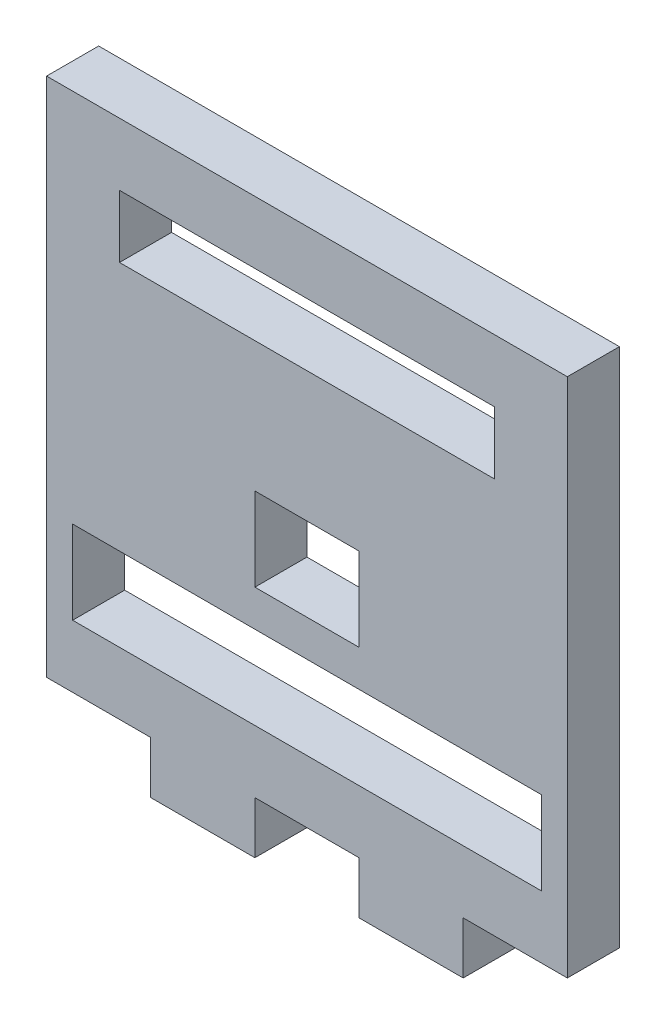
ISO-10303-21;
HEADER;
FILE_DESCRIPTION(('STEP AP214'),'2;1');
FILE_NAME('part.step','',(''),(''),'','','');
FILE_SCHEMA(('AUTOMOTIVE_DESIGN { 1 0 10303 214 1 1 1 1 }'));
ENDSEC;
DATA;
#1=APPLICATION_CONTEXT('core data for automotive mechanical design processes');
#2=APPLICATION_PROTOCOL_DEFINITION('international standard','automotive_design',2000,#1);
#3=PRODUCT_CONTEXT('',#1,'mechanical');
#4=PRODUCT('Part','Part','',(#3));
#5=PRODUCT_RELATED_PRODUCT_CATEGORY('part','',(#4));
#6=PRODUCT_DEFINITION_FORMATION('','',#4);
#7=PRODUCT_DEFINITION_CONTEXT('part definition',#1,'design');
#8=PRODUCT_DEFINITION('design','',#6,#7);
#9=PRODUCT_DEFINITION_SHAPE('','',#8);
#10=(LENGTH_UNIT() NAMED_UNIT(*) SI_UNIT(.MILLI.,.METRE.));
#11=(NAMED_UNIT(*) PLANE_ANGLE_UNIT() SI_UNIT($,.RADIAN.));
#12=(NAMED_UNIT(*) SI_UNIT($,.STERADIAN.) SOLID_ANGLE_UNIT());
#13=UNCERTAINTY_MEASURE_WITH_UNIT(LENGTH_MEASURE(1.E-05),#10,'distance_accuracy_value','');
#14=(GEOMETRIC_REPRESENTATION_CONTEXT(3) GLOBAL_UNCERTAINTY_ASSIGNED_CONTEXT((#13)) GLOBAL_UNIT_ASSIGNED_CONTEXT((#10,
#11,#12)) REPRESENTATION_CONTEXT('',''));
#15=CARTESIAN_POINT('',(0.,0.,0.));
#16=DIRECTION('',(0.,0.,1.));
#17=DIRECTION('',(1.,0.,0.));
#18=AXIS2_PLACEMENT_3D('',#15,#16,#17);
#19=CARTESIAN_POINT('',(0.,0.,5.));
#20=DIRECTION('',(0.,1.,0.));
#21=DIRECTION('',(0.,0.,1.));
#22=AXIS2_PLACEMENT_3D('',#19,#20,#21);
#23=PLANE('',#22);
#24=DIRECTION('',(1.,0.,0.));
#25=VECTOR('',#24,1.);
#26=CARTESIAN_POINT('',(0.,0.,0.));
#27=LINE('',#26,#25);
#28=CARTESIAN_POINT('',(-30.,0.,0.));
#29=VERTEX_POINT('',#28);
#30=CARTESIAN_POINT('',(-20.,0.,0.));
#31=VERTEX_POINT('',#30);
#32=EDGE_CURVE('E375',#29,#31,#27,.T.);
#33=ORIENTED_EDGE('',*,*,#32,.T.);
#34=DIRECTION('',(0.,0.,1.));
#35=VECTOR('',#34,1.);
#36=CARTESIAN_POINT('',(-20.,0.,0.));
#37=LINE('',#36,#35);
#38=CARTESIAN_POINT('',(-20.,0.,5.));
#39=VERTEX_POINT('',#38);
#40=EDGE_CURVE('E56',#31,#39,#37,.T.);
#41=ORIENTED_EDGE('',*,*,#40,.T.);
#42=DIRECTION('',(1.,0.,0.));
#43=VECTOR('',#42,1.);
#44=CARTESIAN_POINT('',(0.,0.,5.));
#45=LINE('',#44,#43);
#46=CARTESIAN_POINT('',(-30.,0.,5.));
#47=VERTEX_POINT('',#46);
#48=EDGE_CURVE('E365',#47,#39,#45,.T.);
#49=ORIENTED_EDGE('',*,*,#48,.F.);
#50=DIRECTION('',(0.,0.,1.));
#51=VECTOR('',#50,1.);
#52=CARTESIAN_POINT('',(-30.,0.,0.));
#53=LINE('',#52,#51);
#54=EDGE_CURVE('E255',#29,#47,#53,.T.);
#55=ORIENTED_EDGE('',*,*,#54,.F.);
#56=EDGE_LOOP('',(#33,#41,#49,#55));
#57=FACE_BOUND('',#56,.T.);
#58=ADVANCED_FACE('F33',(#57),#23,.F.);
#59=CARTESIAN_POINT('',(-10.,0.,5.));
#60=VERTEX_POINT('',#59);
#61=CARTESIAN_POINT('',(0.,0.,5.));
#62=VERTEX_POINT('',#61);
#63=EDGE_CURVE('E48',#60,#62,#45,.T.);
#64=ORIENTED_EDGE('',*,*,#63,.F.);
#65=DIRECTION('',(0.,0.,1.));
#66=VECTOR('',#65,1.);
#67=CARTESIAN_POINT('',(-10.,0.,0.));
#68=LINE('',#67,#66);
#69=CARTESIAN_POINT('',(-10.,0.,0.));
#70=VERTEX_POINT('',#69);
#71=EDGE_CURVE('E231',#70,#60,#68,.T.);
#72=ORIENTED_EDGE('',*,*,#71,.F.);
#73=CARTESIAN_POINT('',(0.,0.,0.));
#74=VERTEX_POINT('',#73);
#75=EDGE_CURVE('E372',#70,#74,#27,.T.);
#76=ORIENTED_EDGE('',*,*,#75,.T.);
#77=DIRECTION('',(0.,0.,-1.));
#78=VECTOR('',#77,1.);
#79=CARTESIAN_POINT('',(0.,0.,5.));
#80=LINE('',#79,#78);
#81=EDGE_CURVE('E364',#62,#74,#80,.T.);
#82=ORIENTED_EDGE('',*,*,#81,.F.);
#83=EDGE_LOOP('',(#64,#72,#76,#82));
#84=FACE_BOUND('',#83,.T.);
#85=ADVANCED_FACE('F401',(#84),#23,.F.);
#86=CARTESIAN_POINT('',(0.,0.,5.));
#87=DIRECTION('',(0.,0.,1.));
#88=DIRECTION('',(1.,0.,0.));
#89=AXIS2_PLACEMENT_3D('',#86,#87,#88);
#90=PLANE('',#89);
#91=DIRECTION('',(0.,1.,0.));
#92=VECTOR('',#91,1.);
#93=CARTESIAN_POINT('',(0.,0.,5.));
#94=LINE('',#93,#92);
#95=CARTESIAN_POINT('',(0.,50.,5.));
#96=VERTEX_POINT('',#95);
#97=EDGE_CURVE('E353',#62,#96,#94,.T.);
#98=ORIENTED_EDGE('',*,*,#97,.T.);
#99=DIRECTION('',(-1.,0.,0.));
#100=VECTOR('',#99,1.);
#101=CARTESIAN_POINT('',(0.,50.,5.));
#102=LINE('',#101,#100);
#103=CARTESIAN_POINT('',(-50.,50.,5.));
#104=VERTEX_POINT('',#103);
#105=EDGE_CURVE('E356',#96,#104,#102,.T.);
#106=ORIENTED_EDGE('',*,*,#105,.T.);
#107=DIRECTION('',(0.,-1.,0.));
#108=VECTOR('',#107,1.);
#109=CARTESIAN_POINT('',(-50.,0.,5.));
#110=LINE('',#109,#108);
#111=CARTESIAN_POINT('',(-50.,0.,5.));
#112=VERTEX_POINT('',#111);
#113=EDGE_CURVE('E359',#104,#112,#110,.T.);
#114=ORIENTED_EDGE('',*,*,#113,.T.);
#115=CARTESIAN_POINT('',(-40.,0.,5.));
#116=VERTEX_POINT('',#115);
#117=EDGE_CURVE('E361',#112,#116,#45,.T.);
#118=ORIENTED_EDGE('',*,*,#117,.T.);
#119=DIRECTION('',(0.,-1.,0.));
#120=VECTOR('',#119,1.);
#121=CARTESIAN_POINT('',(-40.,0.,5.));
#122=LINE('',#121,#120);
#123=CARTESIAN_POINT('',(-40.,-5.,5.));
#124=VERTEX_POINT('',#123);
#125=EDGE_CURVE('E230',#116,#124,#122,.T.);
#126=ORIENTED_EDGE('',*,*,#125,.T.);
#127=DIRECTION('',(1.,0.,0.));
#128=VECTOR('',#127,1.);
#129=CARTESIAN_POINT('',(-40.,-5.,5.));
#130=LINE('',#129,#128);
#131=CARTESIAN_POINT('',(-30.,-5.,5.));
#132=VERTEX_POINT('',#131);
#133=EDGE_CURVE('E246',#124,#132,#130,.T.);
#134=ORIENTED_EDGE('',*,*,#133,.T.);
#135=DIRECTION('',(0.,1.,0.));
#136=VECTOR('',#135,1.);
#137=CARTESIAN_POINT('',(-30.,0.,5.));
#138=LINE('',#137,#136);
#139=EDGE_CURVE('E238',#132,#47,#138,.T.);
#140=ORIENTED_EDGE('',*,*,#139,.T.);
#141=ORIENTED_EDGE('',*,*,#48,.T.);
#142=DIRECTION('',(0.,-1.,0.));
#143=VECTOR('',#142,1.);
#144=CARTESIAN_POINT('',(-20.,0.,5.));
#145=LINE('',#144,#143);
#146=CARTESIAN_POINT('',(-20.,-5.,5.));
#147=VERTEX_POINT('',#146);
#148=EDGE_CURVE('E226',#39,#147,#145,.T.);
#149=ORIENTED_EDGE('',*,*,#148,.T.);
#150=DIRECTION('',(1.,0.,0.));
#151=VECTOR('',#150,1.);
#152=CARTESIAN_POINT('',(-20.,-5.,5.));
#153=LINE('',#152,#151);
#154=CARTESIAN_POINT('',(-10.,-5.,5.));
#155=VERTEX_POINT('',#154);
#156=EDGE_CURVE('E201',#147,#155,#153,.T.);
#157=ORIENTED_EDGE('',*,*,#156,.T.);
#158=DIRECTION('',(0.,1.,0.));
#159=VECTOR('',#158,1.);
#160=CARTESIAN_POINT('',(-10.,0.,5.));
#161=LINE('',#160,#159);
#162=EDGE_CURVE('E220',#155,#60,#161,.T.);
#163=ORIENTED_EDGE('',*,*,#162,.T.);
#164=ORIENTED_EDGE('',*,*,#63,.T.);
#165=EDGE_LOOP('',(#98,#106,#114,#118,#126,#134,#140,#141,#149,#157,#163,#164));
#166=FACE_BOUND('',#165,.T.);
#167=DIRECTION('',(1.,0.,0.));
#168=VECTOR('',#167,1.);
#169=CARTESIAN_POINT('',(-43.,38.,5.));
#170=LINE('',#169,#168);
#171=CARTESIAN_POINT('',(-43.,38.,5.));
#172=VERTEX_POINT('',#171);
#173=CARTESIAN_POINT('',(-7.,38.,5.));
#174=VERTEX_POINT('',#173);
#175=EDGE_CURVE('E324',#172,#174,#170,.T.);
#176=ORIENTED_EDGE('',*,*,#175,.F.);
#177=DIRECTION('',(0.,-1.,0.));
#178=VECTOR('',#177,1.);
#179=CARTESIAN_POINT('',(-43.,44.,5.));
#180=LINE('',#179,#178);
#181=CARTESIAN_POINT('',(-43.,44.,5.));
#182=VERTEX_POINT('',#181);
#183=EDGE_CURVE('E322',#182,#172,#180,.T.);
#184=ORIENTED_EDGE('',*,*,#183,.F.);
#185=DIRECTION('',(-1.,0.,0.));
#186=VECTOR('',#185,1.);
#187=CARTESIAN_POINT('',(-43.,44.,5.));
#188=LINE('',#187,#186);
#189=CARTESIAN_POINT('',(-7.,44.,5.));
#190=VERTEX_POINT('',#189);
#191=EDGE_CURVE('E330',#190,#182,#188,.T.);
#192=ORIENTED_EDGE('',*,*,#191,.F.);
#193=DIRECTION('',(0.,1.,0.));
#194=VECTOR('',#193,1.);
#195=CARTESIAN_POINT('',(-7.,44.,5.));
#196=LINE('',#195,#194);
#197=EDGE_CURVE('E327',#174,#190,#196,.T.);
#198=ORIENTED_EDGE('',*,*,#197,.F.);
#199=EDGE_LOOP('',(#176,#184,#192,#198));
#200=FACE_BOUND('',#199,.T.);
#201=DIRECTION('',(1.,0.,0.));
#202=VECTOR('',#201,1.);
#203=CARTESIAN_POINT('',(-30.,17.5,5.));
#204=LINE('',#203,#202);
#205=CARTESIAN_POINT('',(-30.,17.5,5.));
#206=VERTEX_POINT('',#205);
#207=CARTESIAN_POINT('',(-20.,17.5,5.));
#208=VERTEX_POINT('',#207);
#209=EDGE_CURVE('E293',#206,#208,#204,.T.);
#210=ORIENTED_EDGE('',*,*,#209,.F.);
#211=DIRECTION('',(0.,-1.,0.));
#212=VECTOR('',#211,1.);
#213=CARTESIAN_POINT('',(-30.,25.5,5.));
#214=LINE('',#213,#212);
#215=CARTESIAN_POINT('',(-30.,25.5,5.));
#216=VERTEX_POINT('',#215);
#217=EDGE_CURVE('E291',#216,#206,#214,.T.);
#218=ORIENTED_EDGE('',*,*,#217,.F.);
#219=DIRECTION('',(-1.,0.,0.));
#220=VECTOR('',#219,1.);
#221=CARTESIAN_POINT('',(-30.,25.5,5.));
#222=LINE('',#221,#220);
#223=CARTESIAN_POINT('',(-20.,25.5,5.));
#224=VERTEX_POINT('',#223);
#225=EDGE_CURVE('E299',#224,#216,#222,.T.);
#226=ORIENTED_EDGE('',*,*,#225,.F.);
#227=DIRECTION('',(0.,1.,0.));
#228=VECTOR('',#227,1.);
#229=CARTESIAN_POINT('',(-20.,25.5,5.));
#230=LINE('',#229,#228);
#231=EDGE_CURVE('E296',#208,#224,#230,.T.);
#232=ORIENTED_EDGE('',*,*,#231,.F.);
#233=EDGE_LOOP('',(#210,#218,#226,#232));
#234=FACE_BOUND('',#233,.T.);
#235=DIRECTION('',(1.,0.,0.));
#236=VECTOR('',#235,1.);
#237=CARTESIAN_POINT('',(-47.5,6.,5.));
#238=LINE('',#237,#236);
#239=CARTESIAN_POINT('',(-47.5,6.,5.));
#240=VERTEX_POINT('',#239);
#241=CARTESIAN_POINT('',(-2.5,6.,5.));
#242=VERTEX_POINT('',#241);
#243=EDGE_CURVE('E262',#240,#242,#238,.T.);
#244=ORIENTED_EDGE('',*,*,#243,.F.);
#245=DIRECTION('',(0.,-1.,0.));
#246=VECTOR('',#245,1.);
#247=CARTESIAN_POINT('',(-47.5,14.,5.));
#248=LINE('',#247,#246);
#249=CARTESIAN_POINT('',(-47.5,14.,5.));
#250=VERTEX_POINT('',#249);
#251=EDGE_CURVE('E260',#250,#240,#248,.T.);
#252=ORIENTED_EDGE('',*,*,#251,.F.);
#253=DIRECTION('',(-1.,0.,0.));
#254=VECTOR('',#253,1.);
#255=CARTESIAN_POINT('',(-47.5,14.,5.));
#256=LINE('',#255,#254);
#257=CARTESIAN_POINT('',(-2.5,14.,5.));
#258=VERTEX_POINT('',#257);
#259=EDGE_CURVE('E268',#258,#250,#256,.T.);
#260=ORIENTED_EDGE('',*,*,#259,.F.);
#261=DIRECTION('',(0.,1.,0.));
#262=VECTOR('',#261,1.);
#263=CARTESIAN_POINT('',(-2.5,14.,5.));
#264=LINE('',#263,#262);
#265=EDGE_CURVE('E265',#242,#258,#264,.T.);
#266=ORIENTED_EDGE('',*,*,#265,.F.);
#267=EDGE_LOOP('',(#244,#252,#260,#266));
#268=FACE_BOUND('',#267,.T.);
#269=ADVANCED_FACE('F395',(#166,#200,#234,#268),#90,.T.);
#270=CARTESIAN_POINT('',(0.,0.,0.));
#271=DIRECTION('',(0.,0.,1.));
#272=DIRECTION('',(1.,0.,0.));
#273=AXIS2_PLACEMENT_3D('',#270,#271,#272);
#274=PLANE('',#273);
#275=DIRECTION('',(0.,-1.,0.));
#276=VECTOR('',#275,1.);
#277=CARTESIAN_POINT('',(-30.,25.5,0.));
#278=LINE('',#277,#276);
#279=CARTESIAN_POINT('',(-30.,25.5,0.));
#280=VERTEX_POINT('',#279);
#281=CARTESIAN_POINT('',(-30.,17.5,0.));
#282=VERTEX_POINT('',#281);
#283=EDGE_CURVE('E290',#280,#282,#278,.T.);
#284=ORIENTED_EDGE('',*,*,#283,.T.);
#285=DIRECTION('',(1.,0.,0.));
#286=VECTOR('',#285,1.);
#287=CARTESIAN_POINT('',(-30.,17.5,0.));
#288=LINE('',#287,#286);
#289=CARTESIAN_POINT('',(-20.,17.5,0.));
#290=VERTEX_POINT('',#289);
#291=EDGE_CURVE('E304',#282,#290,#288,.T.);
#292=ORIENTED_EDGE('',*,*,#291,.T.);
#293=DIRECTION('',(0.,1.,0.));
#294=VECTOR('',#293,1.);
#295=CARTESIAN_POINT('',(-20.,25.5,0.));
#296=LINE('',#295,#294);
#297=CARTESIAN_POINT('',(-20.,25.5,0.));
#298=VERTEX_POINT('',#297);
#299=EDGE_CURVE('E307',#290,#298,#296,.T.);
#300=ORIENTED_EDGE('',*,*,#299,.T.);
#301=DIRECTION('',(-1.,0.,0.));
#302=VECTOR('',#301,1.);
#303=CARTESIAN_POINT('',(-30.,25.5,0.));
#304=LINE('',#303,#302);
#305=EDGE_CURVE('E294',#298,#280,#304,.T.);
#306=ORIENTED_EDGE('',*,*,#305,.T.);
#307=EDGE_LOOP('',(#284,#292,#300,#306));
#308=FACE_BOUND('',#307,.T.);
#309=DIRECTION('',(0.,1.,0.));
#310=VECTOR('',#309,1.);
#311=CARTESIAN_POINT('',(0.,0.,0.));
#312=LINE('',#311,#310);
#313=CARTESIAN_POINT('',(0.,50.,0.));
#314=VERTEX_POINT('',#313);
#315=EDGE_CURVE('E352',#74,#314,#312,.T.);
#316=ORIENTED_EDGE('',*,*,#315,.F.);
#317=ORIENTED_EDGE('',*,*,#75,.F.);
#318=DIRECTION('',(0.,1.,0.));
#319=VECTOR('',#318,1.);
#320=CARTESIAN_POINT('',(-10.,0.,0.));
#321=LINE('',#320,#319);
#322=CARTESIAN_POINT('',(-10.,-5.,0.));
#323=VERTEX_POINT('',#322);
#324=EDGE_CURVE('E207',#323,#70,#321,.T.);
#325=ORIENTED_EDGE('',*,*,#324,.F.);
#326=DIRECTION('',(1.,0.,0.));
#327=VECTOR('',#326,1.);
#328=CARTESIAN_POINT('',(-20.,-5.,0.));
#329=LINE('',#328,#327);
#330=CARTESIAN_POINT('',(-20.,-5.,0.));
#331=VERTEX_POINT('',#330);
#332=EDGE_CURVE('E199',#331,#323,#329,.T.);
#333=ORIENTED_EDGE('',*,*,#332,.F.);
#334=DIRECTION('',(0.,-1.,0.));
#335=VECTOR('',#334,1.);
#336=CARTESIAN_POINT('',(-20.,0.,0.));
#337=LINE('',#336,#335);
#338=EDGE_CURVE('E216',#31,#331,#337,.T.);
#339=ORIENTED_EDGE('',*,*,#338,.F.);
#340=ORIENTED_EDGE('',*,*,#32,.F.);
#341=DIRECTION('',(0.,1.,0.));
#342=VECTOR('',#341,1.);
#343=CARTESIAN_POINT('',(-30.,0.,0.));
#344=LINE('',#343,#342);
#345=CARTESIAN_POINT('',(-30.,-5.,0.));
#346=VERTEX_POINT('',#345);
#347=EDGE_CURVE('E241',#346,#29,#344,.T.);
#348=ORIENTED_EDGE('',*,*,#347,.F.);
#349=DIRECTION('',(1.,0.,0.));
#350=VECTOR('',#349,1.);
#351=CARTESIAN_POINT('',(-40.,-5.,0.));
#352=LINE('',#351,#350);
#353=CARTESIAN_POINT('',(-40.,-5.,0.));
#354=VERTEX_POINT('',#353);
#355=EDGE_CURVE('E237',#354,#346,#352,.T.);
#356=ORIENTED_EDGE('',*,*,#355,.F.);
#357=DIRECTION('',(0.,-1.,0.));
#358=VECTOR('',#357,1.);
#359=CARTESIAN_POINT('',(-40.,0.,0.));
#360=LINE('',#359,#358);
#361=CARTESIAN_POINT('',(-40.,0.,0.));
#362=VERTEX_POINT('',#361);
#363=EDGE_CURVE('E234',#362,#354,#360,.T.);
#364=ORIENTED_EDGE('',*,*,#363,.F.);
#365=CARTESIAN_POINT('',(-50.,0.,0.));
#366=VERTEX_POINT('',#365);
#367=EDGE_CURVE('E357',#366,#362,#27,.T.);
#368=ORIENTED_EDGE('',*,*,#367,.F.);
#369=DIRECTION('',(0.,-1.,0.));
#370=VECTOR('',#369,1.);
#371=CARTESIAN_POINT('',(-50.,0.,0.));
#372=LINE('',#371,#370);
#373=CARTESIAN_POINT('',(-50.,50.,0.));
#374=VERTEX_POINT('',#373);
#375=EDGE_CURVE('E370',#374,#366,#372,.T.);
#376=ORIENTED_EDGE('',*,*,#375,.F.);
#377=DIRECTION('',(-1.,0.,0.));
#378=VECTOR('',#377,1.);
#379=CARTESIAN_POINT('',(0.,50.,0.));
#380=LINE('',#379,#378);
#381=EDGE_CURVE('E368',#314,#374,#380,.T.);
#382=ORIENTED_EDGE('',*,*,#381,.F.);
#383=EDGE_LOOP('',(#316,#317,#325,#333,#339,#340,#348,#356,#364,#368,#376,#382));
#384=FACE_BOUND('',#383,.T.);
#385=DIRECTION('',(0.,-1.,0.));
#386=VECTOR('',#385,1.);
#387=CARTESIAN_POINT('',(-43.,44.,0.));
#388=LINE('',#387,#386);
#389=CARTESIAN_POINT('',(-43.,44.,0.));
#390=VERTEX_POINT('',#389);
#391=CARTESIAN_POINT('',(-43.,38.,0.));
#392=VERTEX_POINT('',#391);
#393=EDGE_CURVE('E321',#390,#392,#388,.T.);
#394=ORIENTED_EDGE('',*,*,#393,.T.);
#395=DIRECTION('',(1.,0.,0.));
#396=VECTOR('',#395,1.);
#397=CARTESIAN_POINT('',(-43.,38.,0.));
#398=LINE('',#397,#396);
#399=CARTESIAN_POINT('',(-7.,38.,0.));
#400=VERTEX_POINT('',#399);
#401=EDGE_CURVE('E335',#392,#400,#398,.T.);
#402=ORIENTED_EDGE('',*,*,#401,.T.);
#403=DIRECTION('',(0.,1.,0.));
#404=VECTOR('',#403,1.);
#405=CARTESIAN_POINT('',(-7.,44.,0.));
#406=LINE('',#405,#404);
#407=CARTESIAN_POINT('',(-7.,44.,0.));
#408=VERTEX_POINT('',#407);
#409=EDGE_CURVE('E338',#400,#408,#406,.T.);
#410=ORIENTED_EDGE('',*,*,#409,.T.);
#411=DIRECTION('',(-1.,0.,0.));
#412=VECTOR('',#411,1.);
#413=CARTESIAN_POINT('',(-43.,44.,0.));
#414=LINE('',#413,#412);
#415=EDGE_CURVE('E325',#408,#390,#414,.T.);
#416=ORIENTED_EDGE('',*,*,#415,.T.);
#417=EDGE_LOOP('',(#394,#402,#410,#416));
#418=FACE_BOUND('',#417,.T.);
#419=DIRECTION('',(0.,-1.,0.));
#420=VECTOR('',#419,1.);
#421=CARTESIAN_POINT('',(-47.5,14.,0.));
#422=LINE('',#421,#420);
#423=CARTESIAN_POINT('',(-47.5,14.,0.));
#424=VERTEX_POINT('',#423);
#425=CARTESIAN_POINT('',(-47.5,6.,0.));
#426=VERTEX_POINT('',#425);
#427=EDGE_CURVE('E254',#424,#426,#422,.T.);
#428=ORIENTED_EDGE('',*,*,#427,.T.);
#429=DIRECTION('',(1.,0.,0.));
#430=VECTOR('',#429,1.);
#431=CARTESIAN_POINT('',(-47.5,6.,0.));
#432=LINE('',#431,#430);
#433=CARTESIAN_POINT('',(-2.5,6.,0.));
#434=VERTEX_POINT('',#433);
#435=EDGE_CURVE('E273',#426,#434,#432,.T.);
#436=ORIENTED_EDGE('',*,*,#435,.T.);
#437=DIRECTION('',(0.,1.,0.));
#438=VECTOR('',#437,1.);
#439=CARTESIAN_POINT('',(-2.5,14.,0.));
#440=LINE('',#439,#438);
#441=CARTESIAN_POINT('',(-2.5,14.,0.));
#442=VERTEX_POINT('',#441);
#443=EDGE_CURVE('E276',#434,#442,#440,.T.);
#444=ORIENTED_EDGE('',*,*,#443,.T.);
#445=DIRECTION('',(-1.,0.,0.));
#446=VECTOR('',#445,1.);
#447=CARTESIAN_POINT('',(-47.5,14.,0.));
#448=LINE('',#447,#446);
#449=EDGE_CURVE('E263',#442,#424,#448,.T.);
#450=ORIENTED_EDGE('',*,*,#449,.T.);
#451=EDGE_LOOP('',(#428,#436,#444,#450));
#452=FACE_BOUND('',#451,.T.);
#453=ADVANCED_FACE('F213',(#308,#384,#418,#452),#274,.F.);
#454=CARTESIAN_POINT('',(0.,0.,5.));
#455=DIRECTION('',(-1.,0.,0.));
#456=DIRECTION('',(0.,0.,1.));
#457=AXIS2_PLACEMENT_3D('',#454,#455,#456);
#458=PLANE('',#457);
#459=ORIENTED_EDGE('',*,*,#315,.T.);
#460=DIRECTION('',(0.,0.,-1.));
#461=VECTOR('',#460,1.);
#462=CARTESIAN_POINT('',(0.,50.,5.));
#463=LINE('',#462,#461);
#464=EDGE_CURVE('E11',#96,#314,#463,.T.);
#465=ORIENTED_EDGE('',*,*,#464,.F.);
#466=ORIENTED_EDGE('',*,*,#97,.F.);
#467=ORIENTED_EDGE('',*,*,#81,.T.);
#468=EDGE_LOOP('',(#459,#465,#466,#467));
#469=FACE_BOUND('',#468,.T.);
#470=ADVANCED_FACE('F35',(#469),#458,.F.);
#471=CARTESIAN_POINT('',(0.,50.,5.));
#472=DIRECTION('',(0.,-1.,0.));
#473=DIRECTION('',(0.,0.,-1.));
#474=AXIS2_PLACEMENT_3D('',#471,#472,#473);
#475=PLANE('',#474);
#476=ORIENTED_EDGE('',*,*,#381,.T.);
#477=DIRECTION('',(0.,0.,-1.));
#478=VECTOR('',#477,1.);
#479=CARTESIAN_POINT('',(-50.,50.,5.));
#480=LINE('',#479,#478);
#481=EDGE_CURVE('E41',#104,#374,#480,.T.);
#482=ORIENTED_EDGE('',*,*,#481,.F.);
#483=ORIENTED_EDGE('',*,*,#105,.F.);
#484=ORIENTED_EDGE('',*,*,#464,.T.);
#485=EDGE_LOOP('',(#476,#482,#483,#484));
#486=FACE_BOUND('',#485,.T.);
#487=ADVANCED_FACE('F399',(#486),#475,.F.);
#488=CARTESIAN_POINT('',(-50.,0.,5.));
#489=DIRECTION('',(1.,0.,0.));
#490=DIRECTION('',(0.,0.,-1.));
#491=AXIS2_PLACEMENT_3D('',#488,#489,#490);
#492=PLANE('',#491);
#493=ORIENTED_EDGE('',*,*,#375,.T.);
#494=DIRECTION('',(0.,0.,-1.));
#495=VECTOR('',#494,1.);
#496=CARTESIAN_POINT('',(-50.,0.,5.));
#497=LINE('',#496,#495);
#498=EDGE_CURVE('E378',#112,#366,#497,.T.);
#499=ORIENTED_EDGE('',*,*,#498,.F.);
#500=ORIENTED_EDGE('',*,*,#113,.F.);
#501=ORIENTED_EDGE('',*,*,#481,.T.);
#502=EDGE_LOOP('',(#493,#499,#500,#501));
#503=FACE_BOUND('',#502,.T.);
#504=ADVANCED_FACE('F385',(#503),#492,.F.);
#505=ORIENTED_EDGE('',*,*,#367,.T.);
#506=DIRECTION('',(0.,0.,1.));
#507=VECTOR('',#506,1.);
#508=CARTESIAN_POINT('',(-40.,0.,0.));
#509=LINE('',#508,#507);
#510=EDGE_CURVE('E251',#362,#116,#509,.T.);
#511=ORIENTED_EDGE('',*,*,#510,.T.);
#512=ORIENTED_EDGE('',*,*,#117,.F.);
#513=ORIENTED_EDGE('',*,*,#498,.T.);
#514=EDGE_LOOP('',(#505,#511,#512,#513));
#515=FACE_BOUND('',#514,.T.);
#516=ADVANCED_FACE('F392',(#515),#23,.F.);
#517=CARTESIAN_POINT('',(-43.,44.,5.));
#518=DIRECTION('',(1.,0.,0.));
#519=DIRECTION('',(0.,0.,-1.));
#520=AXIS2_PLACEMENT_3D('',#517,#518,#519);
#521=PLANE('',#520);
#522=ORIENTED_EDGE('',*,*,#393,.F.);
#523=DIRECTION('',(0.,0.,-1.));
#524=VECTOR('',#523,1.);
#525=CARTESIAN_POINT('',(-43.,44.,5.));
#526=LINE('',#525,#524);
#527=EDGE_CURVE('E332',#182,#390,#526,.T.);
#528=ORIENTED_EDGE('',*,*,#527,.F.);
#529=ORIENTED_EDGE('',*,*,#183,.T.);
#530=DIRECTION('',(0.,0.,-1.));
#531=VECTOR('',#530,1.);
#532=CARTESIAN_POINT('',(-43.,38.,5.));
#533=LINE('',#532,#531);
#534=EDGE_CURVE('E349',#172,#392,#533,.T.);
#535=ORIENTED_EDGE('',*,*,#534,.T.);
#536=EDGE_LOOP('',(#522,#528,#529,#535));
#537=FACE_BOUND('',#536,.T.);
#538=ADVANCED_FACE('F435',(#537),#521,.T.);
#539=CARTESIAN_POINT('',(-43.,38.,5.));
#540=DIRECTION('',(0.,1.,0.));
#541=DIRECTION('',(0.,0.,1.));
#542=AXIS2_PLACEMENT_3D('',#539,#540,#541);
#543=PLANE('',#542);
#544=ORIENTED_EDGE('',*,*,#401,.F.);
#545=ORIENTED_EDGE('',*,*,#534,.F.);
#546=ORIENTED_EDGE('',*,*,#175,.T.);
#547=DIRECTION('',(0.,0.,-1.));
#548=VECTOR('',#547,1.);
#549=CARTESIAN_POINT('',(-7.,38.,5.));
#550=LINE('',#549,#548);
#551=EDGE_CURVE('E347',#174,#400,#550,.T.);
#552=ORIENTED_EDGE('',*,*,#551,.T.);
#553=EDGE_LOOP('',(#544,#545,#546,#552));
#554=FACE_BOUND('',#553,.T.);
#555=ADVANCED_FACE('F440',(#554),#543,.T.);
#556=CARTESIAN_POINT('',(-7.,44.,5.));
#557=DIRECTION('',(-1.,0.,0.));
#558=DIRECTION('',(0.,-1.,0.));
#559=AXIS2_PLACEMENT_3D('',#556,#557,#558);
#560=PLANE('',#559);
#561=ORIENTED_EDGE('',*,*,#409,.F.);
#562=ORIENTED_EDGE('',*,*,#551,.F.);
#563=ORIENTED_EDGE('',*,*,#197,.T.);
#564=DIRECTION('',(0.,0.,-1.));
#565=VECTOR('',#564,1.);
#566=CARTESIAN_POINT('',(-7.,44.,5.));
#567=LINE('',#566,#565);
#568=EDGE_CURVE('E345',#190,#408,#567,.T.);
#569=ORIENTED_EDGE('',*,*,#568,.T.);
#570=EDGE_LOOP('',(#561,#562,#563,#569));
#571=FACE_BOUND('',#570,.T.);
#572=ADVANCED_FACE('F460',(#571),#560,.T.);
#573=CARTESIAN_POINT('',(-43.,44.,5.));
#574=DIRECTION('',(0.,-1.,0.));
#575=DIRECTION('',(0.,0.,-1.));
#576=AXIS2_PLACEMENT_3D('',#573,#574,#575);
#577=PLANE('',#576);
#578=ORIENTED_EDGE('',*,*,#415,.F.);
#579=ORIENTED_EDGE('',*,*,#568,.F.);
#580=ORIENTED_EDGE('',*,*,#191,.T.);
#581=ORIENTED_EDGE('',*,*,#527,.T.);
#582=EDGE_LOOP('',(#578,#579,#580,#581));
#583=FACE_BOUND('',#582,.T.);
#584=ADVANCED_FACE('F464',(#583),#577,.T.);
#585=CARTESIAN_POINT('',(-30.,25.5,5.));
#586=DIRECTION('',(1.,0.,0.));
#587=DIRECTION('',(0.,0.,-1.));
#588=AXIS2_PLACEMENT_3D('',#585,#586,#587);
#589=PLANE('',#588);
#590=ORIENTED_EDGE('',*,*,#283,.F.);
#591=DIRECTION('',(0.,0.,-1.));
#592=VECTOR('',#591,1.);
#593=CARTESIAN_POINT('',(-30.,25.5,5.));
#594=LINE('',#593,#592);
#595=EDGE_CURVE('E301',#216,#280,#594,.T.);
#596=ORIENTED_EDGE('',*,*,#595,.F.);
#597=ORIENTED_EDGE('',*,*,#217,.T.);
#598=DIRECTION('',(0.,0.,-1.));
#599=VECTOR('',#598,1.);
#600=CARTESIAN_POINT('',(-30.,17.5,5.));
#601=LINE('',#600,#599);
#602=EDGE_CURVE('E318',#206,#282,#601,.T.);
#603=ORIENTED_EDGE('',*,*,#602,.T.);
#604=EDGE_LOOP('',(#590,#596,#597,#603));
#605=FACE_BOUND('',#604,.T.);
#606=ADVANCED_FACE('F468',(#605),#589,.T.);
#607=CARTESIAN_POINT('',(-30.,17.5,5.));
#608=DIRECTION('',(0.,1.,0.));
#609=DIRECTION('',(0.,0.,1.));
#610=AXIS2_PLACEMENT_3D('',#607,#608,#609);
#611=PLANE('',#610);
#612=ORIENTED_EDGE('',*,*,#291,.F.);
#613=ORIENTED_EDGE('',*,*,#602,.F.);
#614=ORIENTED_EDGE('',*,*,#209,.T.);
#615=DIRECTION('',(0.,0.,-1.));
#616=VECTOR('',#615,1.);
#617=CARTESIAN_POINT('',(-20.,17.5,5.));
#618=LINE('',#617,#616);
#619=EDGE_CURVE('E316',#208,#290,#618,.T.);
#620=ORIENTED_EDGE('',*,*,#619,.T.);
#621=EDGE_LOOP('',(#612,#613,#614,#620));
#622=FACE_BOUND('',#621,.T.);
#623=ADVANCED_FACE('F472',(#622),#611,.T.);
#624=CARTESIAN_POINT('',(-20.,25.5,5.));
#625=DIRECTION('',(-1.,0.,0.));
#626=DIRECTION('',(0.,0.,1.));
#627=AXIS2_PLACEMENT_3D('',#624,#625,#626);
#628=PLANE('',#627);
#629=ORIENTED_EDGE('',*,*,#299,.F.);
#630=ORIENTED_EDGE('',*,*,#619,.F.);
#631=ORIENTED_EDGE('',*,*,#231,.T.);
#632=DIRECTION('',(0.,0.,-1.));
#633=VECTOR('',#632,1.);
#634=CARTESIAN_POINT('',(-20.,25.5,5.));
#635=LINE('',#634,#633);
#636=EDGE_CURVE('E314',#224,#298,#635,.T.);
#637=ORIENTED_EDGE('',*,*,#636,.T.);
#638=EDGE_LOOP('',(#629,#630,#631,#637));
#639=FACE_BOUND('',#638,.T.);
#640=ADVANCED_FACE('F476',(#639),#628,.T.);
#641=CARTESIAN_POINT('',(-30.,25.5,5.));
#642=DIRECTION('',(0.,-1.,0.));
#643=DIRECTION('',(0.,0.,-1.));
#644=AXIS2_PLACEMENT_3D('',#641,#642,#643);
#645=PLANE('',#644);
#646=ORIENTED_EDGE('',*,*,#305,.F.);
#647=ORIENTED_EDGE('',*,*,#636,.F.);
#648=ORIENTED_EDGE('',*,*,#225,.T.);
#649=ORIENTED_EDGE('',*,*,#595,.T.);
#650=EDGE_LOOP('',(#646,#647,#648,#649));
#651=FACE_BOUND('',#650,.T.);
#652=ADVANCED_FACE('F480',(#651),#645,.T.);
#653=CARTESIAN_POINT('',(-47.5,14.,5.));
#654=DIRECTION('',(1.,0.,0.));
#655=DIRECTION('',(0.,0.,-1.));
#656=AXIS2_PLACEMENT_3D('',#653,#654,#655);
#657=PLANE('',#656);
#658=ORIENTED_EDGE('',*,*,#427,.F.);
#659=DIRECTION('',(0.,0.,-1.));
#660=VECTOR('',#659,1.);
#661=CARTESIAN_POINT('',(-47.5,14.,5.));
#662=LINE('',#661,#660);
#663=EDGE_CURVE('E270',#250,#424,#662,.T.);
#664=ORIENTED_EDGE('',*,*,#663,.F.);
#665=ORIENTED_EDGE('',*,*,#251,.T.);
#666=DIRECTION('',(0.,0.,-1.));
#667=VECTOR('',#666,1.);
#668=CARTESIAN_POINT('',(-47.5,6.,5.));
#669=LINE('',#668,#667);
#670=EDGE_CURVE('E287',#240,#426,#669,.T.);
#671=ORIENTED_EDGE('',*,*,#670,.T.);
#672=EDGE_LOOP('',(#658,#664,#665,#671));
#673=FACE_BOUND('',#672,.T.);
#674=ADVANCED_FACE('F484',(#673),#657,.T.);
#675=CARTESIAN_POINT('',(-47.5,6.,5.));
#676=DIRECTION('',(0.,1.,0.));
#677=DIRECTION('',(0.,0.,1.));
#678=AXIS2_PLACEMENT_3D('',#675,#676,#677);
#679=PLANE('',#678);
#680=ORIENTED_EDGE('',*,*,#435,.F.);
#681=ORIENTED_EDGE('',*,*,#670,.F.);
#682=ORIENTED_EDGE('',*,*,#243,.T.);
#683=DIRECTION('',(0.,0.,-1.));
#684=VECTOR('',#683,1.);
#685=CARTESIAN_POINT('',(-2.5,6.,5.));
#686=LINE('',#685,#684);
#687=EDGE_CURVE('E285',#242,#434,#686,.T.);
#688=ORIENTED_EDGE('',*,*,#687,.T.);
#689=EDGE_LOOP('',(#680,#681,#682,#688));
#690=FACE_BOUND('',#689,.T.);
#691=ADVANCED_FACE('F488',(#690),#679,.T.);
#692=CARTESIAN_POINT('',(-2.5,14.,5.));
#693=DIRECTION('',(-1.,0.,0.));
#694=DIRECTION('',(0.,0.,1.));
#695=AXIS2_PLACEMENT_3D('',#692,#693,#694);
#696=PLANE('',#695);
#697=ORIENTED_EDGE('',*,*,#443,.F.);
#698=ORIENTED_EDGE('',*,*,#687,.F.);
#699=ORIENTED_EDGE('',*,*,#265,.T.);
#700=DIRECTION('',(0.,0.,-1.));
#701=VECTOR('',#700,1.);
#702=CARTESIAN_POINT('',(-2.5,14.,5.));
#703=LINE('',#702,#701);
#704=EDGE_CURVE('E283',#258,#442,#703,.T.);
#705=ORIENTED_EDGE('',*,*,#704,.T.);
#706=EDGE_LOOP('',(#697,#698,#699,#705));
#707=FACE_BOUND('',#706,.T.);
#708=ADVANCED_FACE('F423',(#707),#696,.T.);
#709=CARTESIAN_POINT('',(-47.5,14.,5.));
#710=DIRECTION('',(0.,-1.,0.));
#711=DIRECTION('',(1.,0.,0.));
#712=AXIS2_PLACEMENT_3D('',#709,#710,#711);
#713=PLANE('',#712);
#714=ORIENTED_EDGE('',*,*,#449,.F.);
#715=ORIENTED_EDGE('',*,*,#704,.F.);
#716=ORIENTED_EDGE('',*,*,#259,.T.);
#717=ORIENTED_EDGE('',*,*,#663,.T.);
#718=EDGE_LOOP('',(#714,#715,#716,#717));
#719=FACE_BOUND('',#718,.T.);
#720=ADVANCED_FACE('F416',(#719),#713,.T.);
#721=CARTESIAN_POINT('',(-40.,0.,0.));
#722=DIRECTION('',(-1.,0.,0.));
#723=DIRECTION('',(0.,0.,1.));
#724=AXIS2_PLACEMENT_3D('',#721,#722,#723);
#725=PLANE('',#724);
#726=ORIENTED_EDGE('',*,*,#125,.F.);
#727=ORIENTED_EDGE('',*,*,#510,.F.);
#728=ORIENTED_EDGE('',*,*,#363,.T.);
#729=DIRECTION('',(0.,0.,1.));
#730=VECTOR('',#729,1.);
#731=CARTESIAN_POINT('',(-40.,-5.,0.));
#732=LINE('',#731,#730);
#733=EDGE_CURVE('E243',#354,#124,#732,.T.);
#734=ORIENTED_EDGE('',*,*,#733,.T.);
#735=EDGE_LOOP('',(#726,#727,#728,#734));
#736=FACE_BOUND('',#735,.T.);
#737=ADVANCED_FACE('F413',(#736),#725,.T.);
#738=CARTESIAN_POINT('',(-30.,0.,0.));
#739=DIRECTION('',(1.,0.,0.));
#740=DIRECTION('',(0.,1.,0.));
#741=AXIS2_PLACEMENT_3D('',#738,#739,#740);
#742=PLANE('',#741);
#743=ORIENTED_EDGE('',*,*,#139,.F.);
#744=DIRECTION('',(0.,0.,1.));
#745=VECTOR('',#744,1.);
#746=CARTESIAN_POINT('',(-30.,-5.,0.));
#747=LINE('',#746,#745);
#748=EDGE_CURVE('E257',#346,#132,#747,.T.);
#749=ORIENTED_EDGE('',*,*,#748,.F.);
#750=ORIENTED_EDGE('',*,*,#347,.T.);
#751=ORIENTED_EDGE('',*,*,#54,.T.);
#752=EDGE_LOOP('',(#743,#749,#750,#751));
#753=FACE_BOUND('',#752,.T.);
#754=ADVANCED_FACE('F415',(#753),#742,.T.);
#755=CARTESIAN_POINT('',(-40.,-5.,0.));
#756=DIRECTION('',(0.,-1.,0.));
#757=DIRECTION('',(0.,0.,-1.));
#758=AXIS2_PLACEMENT_3D('',#755,#756,#757);
#759=PLANE('',#758);
#760=ORIENTED_EDGE('',*,*,#133,.F.);
#761=ORIENTED_EDGE('',*,*,#733,.F.);
#762=ORIENTED_EDGE('',*,*,#355,.T.);
#763=ORIENTED_EDGE('',*,*,#748,.T.);
#764=EDGE_LOOP('',(#760,#761,#762,#763));
#765=FACE_BOUND('',#764,.T.);
#766=ADVANCED_FACE('F411',(#765),#759,.T.);
#767=CARTESIAN_POINT('',(-20.,0.,0.));
#768=DIRECTION('',(-1.,0.,0.));
#769=DIRECTION('',(0.,0.,1.));
#770=AXIS2_PLACEMENT_3D('',#767,#768,#769);
#771=PLANE('',#770);
#772=ORIENTED_EDGE('',*,*,#148,.F.);
#773=ORIENTED_EDGE('',*,*,#40,.F.);
#774=ORIENTED_EDGE('',*,*,#338,.T.);
#775=DIRECTION('',(0.,0.,1.));
#776=VECTOR('',#775,1.);
#777=CARTESIAN_POINT('',(-20.,-5.,0.));
#778=LINE('',#777,#776);
#779=EDGE_CURVE('E196',#331,#147,#778,.T.);
#780=ORIENTED_EDGE('',*,*,#779,.T.);
#781=EDGE_LOOP('',(#772,#773,#774,#780));
#782=FACE_BOUND('',#781,.T.);
#783=ADVANCED_FACE('F219',(#782),#771,.T.);
#784=CARTESIAN_POINT('',(-10.,0.,0.));
#785=DIRECTION('',(1.,0.,0.));
#786=DIRECTION('',(0.,0.,-1.));
#787=AXIS2_PLACEMENT_3D('',#784,#785,#786);
#788=PLANE('',#787);
#789=ORIENTED_EDGE('',*,*,#162,.F.);
#790=DIRECTION('',(0.,0.,1.));
#791=VECTOR('',#790,1.);
#792=CARTESIAN_POINT('',(-10.,-5.,0.));
#793=LINE('',#792,#791);
#794=EDGE_CURVE('E206',#323,#155,#793,.T.);
#795=ORIENTED_EDGE('',*,*,#794,.F.);
#796=ORIENTED_EDGE('',*,*,#324,.T.);
#797=ORIENTED_EDGE('',*,*,#71,.T.);
#798=EDGE_LOOP('',(#789,#795,#796,#797));
#799=FACE_BOUND('',#798,.T.);
#800=ADVANCED_FACE('F404',(#799),#788,.T.);
#801=CARTESIAN_POINT('',(-20.,-5.,0.));
#802=DIRECTION('',(0.,-1.,0.));
#803=DIRECTION('',(0.,0.,-1.));
#804=AXIS2_PLACEMENT_3D('',#801,#802,#803);
#805=PLANE('',#804);
#806=ORIENTED_EDGE('',*,*,#156,.F.);
#807=ORIENTED_EDGE('',*,*,#779,.F.);
#808=ORIENTED_EDGE('',*,*,#332,.T.);
#809=ORIENTED_EDGE('',*,*,#794,.T.);
#810=EDGE_LOOP('',(#806,#807,#808,#809));
#811=FACE_BOUND('',#810,.T.);
#812=ADVANCED_FACE('F198',(#811),#805,.T.);
#813=CLOSED_SHELL('',(#58,#85,#269,#453,#470,#487,#504,#516,#538,#555,#572,#584,#606,#623,#640,
#652,#674,#691,#708,#720,#737,#754,#766,#783,#800,#812));
#814=MANIFOLD_SOLID_BREP('B2',#813);
#815=ADVANCED_BREP_SHAPE_REPRESENTATION('',(#18,#814),#14);
#816=SHAPE_DEFINITION_REPRESENTATION(#9,#815);
ENDSEC;
END-ISO-10303-21;
